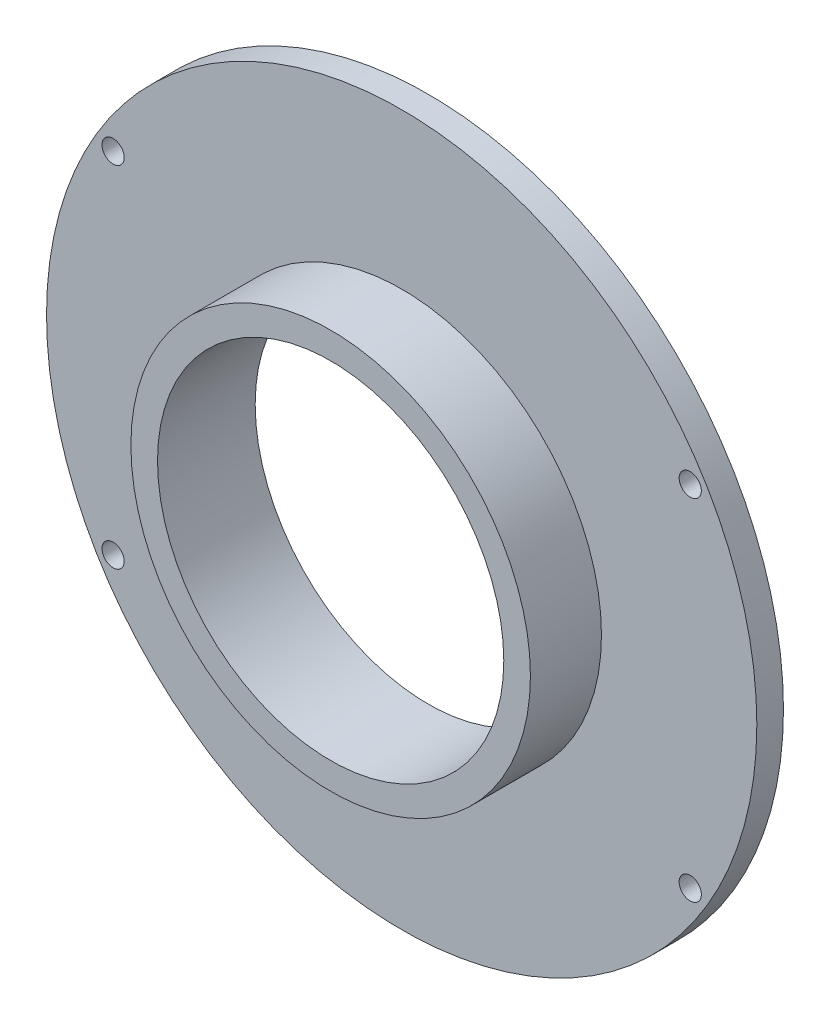
ISO-10303-21;
HEADER;
FILE_DESCRIPTION(('STEP AP214'),'2;1');
FILE_NAME('part.step','',(''),(''),'','','');
FILE_SCHEMA(('AUTOMOTIVE_DESIGN { 1 0 10303 214 1 1 1 1 }'));
ENDSEC;
DATA;
#1=APPLICATION_CONTEXT('core data for automotive mechanical design processes');
#2=APPLICATION_PROTOCOL_DEFINITION('international standard','automotive_design',2000,#1);
#3=PRODUCT_CONTEXT('',#1,'mechanical');
#4=PRODUCT('Part','Part','',(#3));
#5=PRODUCT_RELATED_PRODUCT_CATEGORY('part','',(#4));
#6=PRODUCT_DEFINITION_FORMATION('','',#4);
#7=PRODUCT_DEFINITION_CONTEXT('part definition',#1,'design');
#8=PRODUCT_DEFINITION('design','',#6,#7);
#9=PRODUCT_DEFINITION_SHAPE('','',#8);
#10=(LENGTH_UNIT() NAMED_UNIT(*) SI_UNIT(.MILLI.,.METRE.));
#11=(NAMED_UNIT(*) PLANE_ANGLE_UNIT() SI_UNIT($,.RADIAN.));
#12=(NAMED_UNIT(*) SI_UNIT($,.STERADIAN.) SOLID_ANGLE_UNIT());
#13=UNCERTAINTY_MEASURE_WITH_UNIT(LENGTH_MEASURE(1.E-05),#10,'distance_accuracy_value','');
#14=(GEOMETRIC_REPRESENTATION_CONTEXT(3) GLOBAL_UNCERTAINTY_ASSIGNED_CONTEXT((#13)) GLOBAL_UNIT_ASSIGNED_CONTEXT((#10,
#11,#12)) REPRESENTATION_CONTEXT('',''));
#15=CARTESIAN_POINT('',(0.,0.,0.));
#16=DIRECTION('',(0.,0.,1.));
#17=DIRECTION('',(1.,0.,0.));
#18=AXIS2_PLACEMENT_3D('',#15,#16,#17);
#19=CARTESIAN_POINT('',(0.,0.,8.));
#20=DIRECTION('',(0.,0.,-1.));
#21=DIRECTION('',(-1.,0.,0.));
#22=AXIS2_PLACEMENT_3D('',#19,#20,#21);
#23=CYLINDRICAL_SURFACE('',#22,22.5);
#24=CARTESIAN_POINT('',(0.,0.,8.));
#25=DIRECTION('',(0.,0.,1.));
#26=DIRECTION('',(1.,0.,0.));
#27=AXIS2_PLACEMENT_3D('',#24,#25,#26);
#28=CIRCLE('',#27,22.5);
#29=CARTESIAN_POINT('',(22.5,0.,8.));
#30=VERTEX_POINT('',#29);
#31=EDGE_CURVE('E10',#30,#30,#28,.T.);
#32=ORIENTED_EDGE('',*,*,#31,.F.);
#33=EDGE_LOOP('',(#32));
#34=FACE_BOUND('',#33,.T.);
#35=CARTESIAN_POINT('',(0.,0.,0.));
#36=DIRECTION('',(0.,0.,1.));
#37=DIRECTION('',(1.,0.,0.));
#38=AXIS2_PLACEMENT_3D('',#35,#36,#37);
#39=CIRCLE('',#38,22.5);
#40=CARTESIAN_POINT('',(22.5,0.,0.));
#41=VERTEX_POINT('',#40);
#42=EDGE_CURVE('E51',#41,#41,#39,.T.);
#43=ORIENTED_EDGE('',*,*,#42,.T.);
#44=EDGE_LOOP('',(#43));
#45=FACE_BOUND('',#44,.T.);
#46=ADVANCED_FACE('F43',(#34,#45),#23,.T.);
#47=CARTESIAN_POINT('',(0.,0.,8.));
#48=DIRECTION('',(0.,0.,1.));
#49=DIRECTION('',(1.,0.,0.));
#50=AXIS2_PLACEMENT_3D('',#47,#48,#49);
#51=PLANE('',#50);
#52=CARTESIAN_POINT('',(0.,0.,8.));
#53=DIRECTION('',(0.,0.,1.));
#54=DIRECTION('',(1.,0.,0.));
#55=AXIS2_PLACEMENT_3D('',#52,#53,#54);
#56=CIRCLE('',#55,19.5);
#57=CARTESIAN_POINT('',(19.5,0.,8.));
#58=VERTEX_POINT('',#57);
#59=EDGE_CURVE('E76',#58,#58,#56,.T.);
#60=ORIENTED_EDGE('',*,*,#59,.F.);
#61=EDGE_LOOP('',(#60));
#62=FACE_BOUND('',#61,.T.);
#63=ORIENTED_EDGE('',*,*,#31,.T.);
#64=EDGE_LOOP('',(#63));
#65=FACE_BOUND('',#64,.T.);
#66=ADVANCED_FACE('F116',(#62,#65),#51,.T.);
#67=CARTESIAN_POINT('',(0.,0.,-3.));
#68=DIRECTION('',(0.,0.,1.));
#69=DIRECTION('',(1.,0.,0.));
#70=AXIS2_PLACEMENT_3D('',#67,#68,#69);
#71=CYLINDRICAL_SURFACE('',#70,40.);
#72=CARTESIAN_POINT('',(0.,0.,-3.));
#73=DIRECTION('',(0.,0.,-1.));
#74=DIRECTION('',(-1.,0.,0.));
#75=AXIS2_PLACEMENT_3D('',#72,#73,#74);
#76=CIRCLE('',#75,40.);
#77=CARTESIAN_POINT('',(-40.,0.,-3.));
#78=VERTEX_POINT('',#77);
#79=EDGE_CURVE('E60',#78,#78,#76,.T.);
#80=ORIENTED_EDGE('',*,*,#79,.F.);
#81=EDGE_LOOP('',(#80));
#82=FACE_BOUND('',#81,.T.);
#83=CARTESIAN_POINT('',(0.,0.,0.));
#84=DIRECTION('',(0.,0.,-1.));
#85=DIRECTION('',(-1.,0.,0.));
#86=AXIS2_PLACEMENT_3D('',#83,#84,#85);
#87=CIRCLE('',#86,40.);
#88=CARTESIAN_POINT('',(-40.,0.,0.));
#89=VERTEX_POINT('',#88);
#90=EDGE_CURVE('E58',#89,#89,#87,.T.);
#91=ORIENTED_EDGE('',*,*,#90,.T.);
#92=EDGE_LOOP('',(#91));
#93=FACE_BOUND('',#92,.T.);
#94=ADVANCED_FACE('F97',(#82,#93),#71,.T.);
#95=CARTESIAN_POINT('',(0.,0.,-3.));
#96=DIRECTION('',(0.,0.,-1.));
#97=DIRECTION('',(-1.,0.,0.));
#98=AXIS2_PLACEMENT_3D('',#95,#96,#97);
#99=PLANE('',#98);
#100=CARTESIAN_POINT('',(32.5,19.6913686675152,-3.));
#101=DIRECTION('',(0.,0.,-1.));
#102=DIRECTION('',(1.,0.,0.));
#103=AXIS2_PLACEMENT_3D('',#100,#101,#102);
#104=CIRCLE('',#103,1.25);
#105=CARTESIAN_POINT('',(33.75,19.6913686675152,-3.));
#106=VERTEX_POINT('',#105);
#107=EDGE_CURVE('E197',#106,#106,#104,.T.);
#108=ORIENTED_EDGE('',*,*,#107,.F.);
#109=EDGE_LOOP('',(#108));
#110=FACE_BOUND('',#109,.T.);
#111=CARTESIAN_POINT('',(-32.5,-19.6913686675152,-3.));
#112=DIRECTION('',(0.,0.,-1.));
#113=DIRECTION('',(1.,0.,0.));
#114=AXIS2_PLACEMENT_3D('',#111,#112,#113);
#115=CIRCLE('',#114,1.25);
#116=CARTESIAN_POINT('',(-31.25,-19.6913686675152,-3.));
#117=VERTEX_POINT('',#116);
#118=EDGE_CURVE('E200',#117,#117,#115,.T.);
#119=ORIENTED_EDGE('',*,*,#118,.F.);
#120=EDGE_LOOP('',(#119));
#121=FACE_BOUND('',#120,.T.);
#122=CARTESIAN_POINT('',(32.5,-19.6913686675152,-3.));
#123=DIRECTION('',(0.,0.,-1.));
#124=DIRECTION('',(-1.,0.,0.));
#125=AXIS2_PLACEMENT_3D('',#122,#123,#124);
#126=CIRCLE('',#125,1.25);
#127=CARTESIAN_POINT('',(31.25,-19.6913686675152,-3.));
#128=VERTEX_POINT('',#127);
#129=EDGE_CURVE('E202',#128,#128,#126,.T.);
#130=ORIENTED_EDGE('',*,*,#129,.F.);
#131=EDGE_LOOP('',(#130));
#132=FACE_BOUND('',#131,.T.);
#133=CARTESIAN_POINT('',(-32.5,19.6913686675152,-3.));
#134=DIRECTION('',(0.,0.,-1.));
#135=DIRECTION('',(-1.,0.,0.));
#136=AXIS2_PLACEMENT_3D('',#133,#134,#135);
#137=CIRCLE('',#136,1.25);
#138=CARTESIAN_POINT('',(-33.75,19.6913686675152,-3.));
#139=VERTEX_POINT('',#138);
#140=EDGE_CURVE('E66',#139,#139,#137,.T.);
#141=ORIENTED_EDGE('',*,*,#140,.F.);
#142=EDGE_LOOP('',(#141));
#143=FACE_BOUND('',#142,.T.);
#144=CARTESIAN_POINT('',(0.,0.,-3.));
#145=DIRECTION('',(0.,0.,1.));
#146=DIRECTION('',(1.,0.,0.));
#147=AXIS2_PLACEMENT_3D('',#144,#145,#146);
#148=CIRCLE('',#147,19.5);
#149=CARTESIAN_POINT('',(19.5,0.,-3.));
#150=VERTEX_POINT('',#149);
#151=EDGE_CURVE('E81',#150,#150,#148,.T.);
#152=ORIENTED_EDGE('',*,*,#151,.T.);
#153=EDGE_LOOP('',(#152));
#154=FACE_BOUND('',#153,.T.);
#155=ORIENTED_EDGE('',*,*,#79,.T.);
#156=EDGE_LOOP('',(#155));
#157=FACE_BOUND('',#156,.T.);
#158=ADVANCED_FACE('F102',(#110,#121,#132,#143,#154,#157),#99,.T.);
#159=CARTESIAN_POINT('',(0.,0.,0.));
#160=DIRECTION('',(0.,0.,-1.));
#161=DIRECTION('',(-1.,0.,0.));
#162=AXIS2_PLACEMENT_3D('',#159,#160,#161);
#163=PLANE('',#162);
#164=CARTESIAN_POINT('',(32.5,19.6913686675152,0.));
#165=DIRECTION('',(0.,0.,-1.));
#166=DIRECTION('',(-1.,0.,0.));
#167=AXIS2_PLACEMENT_3D('',#164,#165,#166);
#168=CIRCLE('',#167,1.25);
#169=CARTESIAN_POINT('',(31.25,19.6913686675152,0.));
#170=VERTEX_POINT('',#169);
#171=EDGE_CURVE('E46',#170,#170,#168,.T.);
#172=ORIENTED_EDGE('',*,*,#171,.T.);
#173=EDGE_LOOP('',(#172));
#174=FACE_BOUND('',#173,.T.);
#175=CARTESIAN_POINT('',(-32.5,-19.6913686675152,0.));
#176=DIRECTION('',(0.,0.,-1.));
#177=DIRECTION('',(-1.,0.,0.));
#178=AXIS2_PLACEMENT_3D('',#175,#176,#177);
#179=CIRCLE('',#178,1.25);
#180=CARTESIAN_POINT('',(-33.75,-19.6913686675152,0.));
#181=VERTEX_POINT('',#180);
#182=EDGE_CURVE('E72',#181,#181,#179,.T.);
#183=ORIENTED_EDGE('',*,*,#182,.T.);
#184=EDGE_LOOP('',(#183));
#185=FACE_BOUND('',#184,.T.);
#186=CARTESIAN_POINT('',(32.5,-19.6913686675152,0.));
#187=DIRECTION('',(0.,0.,-1.));
#188=DIRECTION('',(-1.,0.,0.));
#189=AXIS2_PLACEMENT_3D('',#186,#187,#188);
#190=CIRCLE('',#189,1.25);
#191=CARTESIAN_POINT('',(31.25,-19.6913686675152,0.));
#192=VERTEX_POINT('',#191);
#193=EDGE_CURVE('E70',#192,#192,#190,.T.);
#194=ORIENTED_EDGE('',*,*,#193,.T.);
#195=EDGE_LOOP('',(#194));
#196=FACE_BOUND('',#195,.T.);
#197=CARTESIAN_POINT('',(-32.5,19.6913686675152,0.));
#198=DIRECTION('',(0.,0.,-1.));
#199=DIRECTION('',(-1.,0.,0.));
#200=AXIS2_PLACEMENT_3D('',#197,#198,#199);
#201=CIRCLE('',#200,1.25);
#202=CARTESIAN_POINT('',(-33.75,19.6913686675152,0.));
#203=VERTEX_POINT('',#202);
#204=EDGE_CURVE('E61',#203,#203,#201,.T.);
#205=ORIENTED_EDGE('',*,*,#204,.T.);
#206=EDGE_LOOP('',(#205));
#207=FACE_BOUND('',#206,.T.);
#208=ORIENTED_EDGE('',*,*,#42,.F.);
#209=EDGE_LOOP('',(#208));
#210=FACE_BOUND('',#209,.T.);
#211=ORIENTED_EDGE('',*,*,#90,.F.);
#212=EDGE_LOOP('',(#211));
#213=FACE_BOUND('',#212,.T.);
#214=ADVANCED_FACE('F101',(#174,#185,#196,#207,#210,#213),#163,.F.);
#215=CARTESIAN_POINT('',(0.,0.,-3.));
#216=DIRECTION('',(0.,0.,1.));
#217=DIRECTION('',(1.,0.,0.));
#218=AXIS2_PLACEMENT_3D('',#215,#216,#217);
#219=CYLINDRICAL_SURFACE('',#218,19.5);
#220=ORIENTED_EDGE('',*,*,#151,.F.);
#221=EDGE_LOOP('',(#220));
#222=FACE_BOUND('',#221,.T.);
#223=ORIENTED_EDGE('',*,*,#59,.T.);
#224=EDGE_LOOP('',(#223));
#225=FACE_BOUND('',#224,.T.);
#226=ADVANCED_FACE('F103',(#222,#225),#219,.F.);
#227=CARTESIAN_POINT('',(-32.5,19.6913686675152,8.));
#228=DIRECTION('',(0.,0.,-1.));
#229=DIRECTION('',(-1.,0.,0.));
#230=AXIS2_PLACEMENT_3D('',#227,#228,#229);
#231=CYLINDRICAL_SURFACE('',#230,1.25);
#232=ORIENTED_EDGE('',*,*,#140,.T.);
#233=EDGE_LOOP('',(#232));
#234=FACE_BOUND('',#233,.T.);
#235=ORIENTED_EDGE('',*,*,#204,.F.);
#236=EDGE_LOOP('',(#235));
#237=FACE_BOUND('',#236,.T.);
#238=ADVANCED_FACE('F112',(#234,#237),#231,.F.);
#239=CARTESIAN_POINT('',(32.5,-19.6913686675152,8.));
#240=DIRECTION('',(0.,0.,-1.));
#241=DIRECTION('',(-1.,0.,0.));
#242=AXIS2_PLACEMENT_3D('',#239,#240,#241);
#243=CYLINDRICAL_SURFACE('',#242,1.25);
#244=ORIENTED_EDGE('',*,*,#129,.T.);
#245=EDGE_LOOP('',(#244));
#246=FACE_BOUND('',#245,.T.);
#247=ORIENTED_EDGE('',*,*,#193,.F.);
#248=EDGE_LOOP('',(#247));
#249=FACE_BOUND('',#248,.T.);
#250=ADVANCED_FACE('F161',(#246,#249),#243,.F.);
#251=CARTESIAN_POINT('',(-32.5,-19.6913686675152,8.));
#252=DIRECTION('',(0.,0.,-1.));
#253=DIRECTION('',(-1.,0.,0.));
#254=AXIS2_PLACEMENT_3D('',#251,#252,#253);
#255=CYLINDRICAL_SURFACE('',#254,1.25);
#256=ORIENTED_EDGE('',*,*,#118,.T.);
#257=EDGE_LOOP('',(#256));
#258=FACE_BOUND('',#257,.T.);
#259=ORIENTED_EDGE('',*,*,#182,.F.);
#260=EDGE_LOOP('',(#259));
#261=FACE_BOUND('',#260,.T.);
#262=ADVANCED_FACE('F173',(#258,#261),#255,.F.);
#263=CARTESIAN_POINT('',(32.5,19.6913686675152,8.));
#264=DIRECTION('',(0.,0.,-1.));
#265=DIRECTION('',(-1.,0.,0.));
#266=AXIS2_PLACEMENT_3D('',#263,#264,#265);
#267=CYLINDRICAL_SURFACE('',#266,1.25);
#268=ORIENTED_EDGE('',*,*,#107,.T.);
#269=EDGE_LOOP('',(#268));
#270=FACE_BOUND('',#269,.T.);
#271=ORIENTED_EDGE('',*,*,#171,.F.);
#272=EDGE_LOOP('',(#271));
#273=FACE_BOUND('',#272,.T.);
#274=ADVANCED_FACE('F182',(#270,#273),#267,.F.);
#275=CLOSED_SHELL('',(#46,#66,#94,#158,#214,#226,#238,#250,#262,#274));
#276=MANIFOLD_SOLID_BREP('B2',#275);
#277=ADVANCED_BREP_SHAPE_REPRESENTATION('',(#18,#276),#14);
#278=SHAPE_DEFINITION_REPRESENTATION(#9,#277);
ENDSEC;
END-ISO-10303-21;
